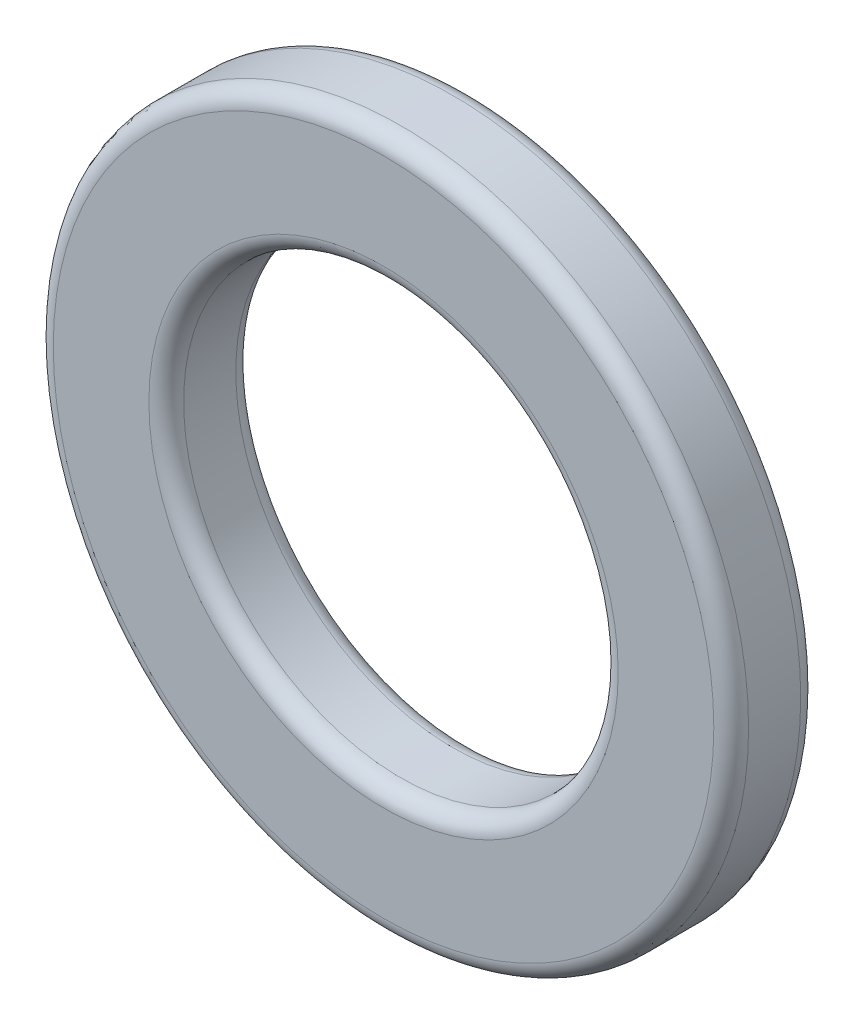
ISO-10303-21;
HEADER;
FILE_DESCRIPTION(('STEP AP214'),'2;1');
FILE_NAME('part.step','',(''),(''),'','','');
FILE_SCHEMA(('AUTOMOTIVE_DESIGN { 1 0 10303 214 1 1 1 1 }'));
ENDSEC;
DATA;
#1=APPLICATION_CONTEXT('core data for automotive mechanical design processes');
#2=APPLICATION_PROTOCOL_DEFINITION('international standard','automotive_design',2000,#1);
#3=PRODUCT_CONTEXT('',#1,'mechanical');
#4=PRODUCT('Part','Part','',(#3));
#5=PRODUCT_RELATED_PRODUCT_CATEGORY('part','',(#4));
#6=PRODUCT_DEFINITION_FORMATION('','',#4);
#7=PRODUCT_DEFINITION_CONTEXT('part definition',#1,'design');
#8=PRODUCT_DEFINITION('design','',#6,#7);
#9=PRODUCT_DEFINITION_SHAPE('','',#8);
#10=(LENGTH_UNIT() NAMED_UNIT(*) SI_UNIT(.MILLI.,.METRE.));
#11=(NAMED_UNIT(*) PLANE_ANGLE_UNIT() SI_UNIT($,.RADIAN.));
#12=(NAMED_UNIT(*) SI_UNIT($,.STERADIAN.) SOLID_ANGLE_UNIT());
#13=UNCERTAINTY_MEASURE_WITH_UNIT(LENGTH_MEASURE(1.E-05),#10,'distance_accuracy_value','');
#14=(GEOMETRIC_REPRESENTATION_CONTEXT(3) GLOBAL_UNCERTAINTY_ASSIGNED_CONTEXT((#13)) GLOBAL_UNIT_ASSIGNED_CONTEXT((#10,
#11,#12)) REPRESENTATION_CONTEXT('',''));
#15=CARTESIAN_POINT('',(0.,0.,0.));
#16=DIRECTION('',(0.,0.,1.));
#17=DIRECTION('',(1.,0.,0.));
#18=AXIS2_PLACEMENT_3D('',#15,#16,#17);
#19=CARTESIAN_POINT('',(0.,0.,2.54));
#20=DIRECTION('',(0.,0.,1.));
#21=DIRECTION('',(1.,0.,0.));
#22=AXIS2_PLACEMENT_3D('',#19,#20,#21);
#23=PLANE('',#22);
#24=CARTESIAN_POINT('',(0.,0.,2.54));
#25=DIRECTION('',(0.,0.,1.));
#26=DIRECTION('',(1.,0.,0.));
#27=AXIS2_PLACEMENT_3D('',#24,#25,#26);
#28=CIRCLE('',#27,6.858);
#29=CARTESIAN_POINT('',(6.858,0.,2.54));
#30=VERTEX_POINT('',#29);
#31=EDGE_CURVE('E62',#30,#30,#28,.F.);
#32=ORIENTED_EDGE('',*,*,#31,.T.);
#33=EDGE_LOOP('',(#32));
#34=FACE_BOUND('',#33,.T.);
#35=CARTESIAN_POINT('',(0.,0.,2.54));
#36=DIRECTION('',(0.,0.,1.));
#37=DIRECTION('',(1.,0.,0.));
#38=AXIS2_PLACEMENT_3D('',#35,#36,#37);
#39=CIRCLE('',#38,9.652);
#40=CARTESIAN_POINT('',(9.652,0.,2.54));
#41=VERTEX_POINT('',#40);
#42=EDGE_CURVE('E66',#41,#41,#39,.T.);
#43=ORIENTED_EDGE('',*,*,#42,.T.);
#44=EDGE_LOOP('',(#43));
#45=FACE_BOUND('',#44,.T.);
#46=ADVANCED_FACE('F38',(#34,#45),#23,.T.);
#47=CARTESIAN_POINT('',(0.,0.,0.));
#48=DIRECTION('',(0.,0.,1.));
#49=DIRECTION('',(1.,0.,0.));
#50=AXIS2_PLACEMENT_3D('',#47,#48,#49);
#51=PLANE('',#50);
#52=CARTESIAN_POINT('',(0.,0.,0.));
#53=DIRECTION('',(0.,0.,1.));
#54=DIRECTION('',(1.,0.,0.));
#55=AXIS2_PLACEMENT_3D('',#52,#53,#54);
#56=CIRCLE('',#55,9.652);
#57=CARTESIAN_POINT('',(9.652,0.,0.));
#58=VERTEX_POINT('',#57);
#59=EDGE_CURVE('E10',#58,#58,#56,.F.);
#60=ORIENTED_EDGE('',*,*,#59,.T.);
#61=EDGE_LOOP('',(#60));
#62=FACE_BOUND('',#61,.T.);
#63=CARTESIAN_POINT('',(0.,0.,0.));
#64=DIRECTION('',(0.,0.,1.));
#65=DIRECTION('',(1.,0.,0.));
#66=AXIS2_PLACEMENT_3D('',#63,#64,#65);
#67=CIRCLE('',#66,6.858);
#68=CARTESIAN_POINT('',(6.858,0.,0.));
#69=VERTEX_POINT('',#68);
#70=EDGE_CURVE('E46',#69,#69,#67,.T.);
#71=ORIENTED_EDGE('',*,*,#70,.T.);
#72=EDGE_LOOP('',(#71));
#73=FACE_BOUND('',#72,.T.);
#74=ADVANCED_FACE('F90',(#62,#73),#51,.F.);
#75=CARTESIAN_POINT('',(0.,0.,2.54));
#76=DIRECTION('',(0.,0.,-1.));
#77=DIRECTION('',(-1.,0.,0.));
#78=AXIS2_PLACEMENT_3D('',#75,#76,#77);
#79=CYLINDRICAL_SURFACE('',#78,10.16);
#80=CARTESIAN_POINT('',(0.,0.,2.032));
#81=DIRECTION('',(0.,0.,1.));
#82=DIRECTION('',(1.,0.,0.));
#83=AXIS2_PLACEMENT_3D('',#80,#81,#82);
#84=CIRCLE('',#83,10.16);
#85=CARTESIAN_POINT('',(10.16,0.,2.032));
#86=VERTEX_POINT('',#85);
#87=EDGE_CURVE('E51',#86,#86,#84,.F.);
#88=ORIENTED_EDGE('',*,*,#87,.T.);
#89=EDGE_LOOP('',(#88));
#90=FACE_BOUND('',#89,.T.);
#91=CARTESIAN_POINT('',(0.,0.,0.508));
#92=DIRECTION('',(0.,0.,1.));
#93=DIRECTION('',(1.,0.,0.));
#94=AXIS2_PLACEMENT_3D('',#91,#92,#93);
#95=CIRCLE('',#94,10.16);
#96=CARTESIAN_POINT('',(10.16,0.,0.508));
#97=VERTEX_POINT('',#96);
#98=EDGE_CURVE('E56',#97,#97,#95,.T.);
#99=ORIENTED_EDGE('',*,*,#98,.T.);
#100=EDGE_LOOP('',(#99));
#101=FACE_BOUND('',#100,.T.);
#102=ADVANCED_FACE('F96',(#90,#101),#79,.T.);
#103=CARTESIAN_POINT('',(0.,0.,2.54));
#104=DIRECTION('',(0.,0.,-1.));
#105=DIRECTION('',(-1.,0.,0.));
#106=AXIS2_PLACEMENT_3D('',#103,#104,#105);
#107=CYLINDRICAL_SURFACE('',#106,6.35);
#108=CARTESIAN_POINT('',(0.,0.,2.032));
#109=DIRECTION('',(0.,0.,1.));
#110=DIRECTION('',(1.,0.,0.));
#111=AXIS2_PLACEMENT_3D('',#108,#109,#110);
#112=CIRCLE('',#111,6.35);
#113=CARTESIAN_POINT('',(6.35,0.,2.032));
#114=VERTEX_POINT('',#113);
#115=EDGE_CURVE('E70',#114,#114,#112,.T.);
#116=ORIENTED_EDGE('',*,*,#115,.T.);
#117=EDGE_LOOP('',(#116));
#118=FACE_BOUND('',#117,.T.);
#119=CARTESIAN_POINT('',(0.,0.,0.508));
#120=DIRECTION('',(0.,0.,1.));
#121=DIRECTION('',(1.,0.,0.));
#122=AXIS2_PLACEMENT_3D('',#119,#120,#121);
#123=CIRCLE('',#122,6.35);
#124=CARTESIAN_POINT('',(6.35,0.,0.508));
#125=VERTEX_POINT('',#124);
#126=EDGE_CURVE('E74',#125,#125,#123,.F.);
#127=ORIENTED_EDGE('',*,*,#126,.T.);
#128=EDGE_LOOP('',(#127));
#129=FACE_BOUND('',#128,.T.);
#130=ADVANCED_FACE('F79',(#118,#129),#107,.F.);
#131=CARTESIAN_POINT('',(0.,0.,2.032));
#132=DIRECTION('',(0.,0.,1.));
#133=DIRECTION('',(1.,0.,0.));
#134=AXIS2_PLACEMENT_3D('',#131,#132,#133);
#135=TOROIDAL_SURFACE('',#134,6.858,0.508);
#136=ORIENTED_EDGE('',*,*,#31,.F.);
#137=EDGE_LOOP('',(#136));
#138=FACE_BOUND('',#137,.T.);
#139=ORIENTED_EDGE('',*,*,#115,.F.);
#140=EDGE_LOOP('',(#139));
#141=FACE_BOUND('',#140,.T.);
#142=ADVANCED_FACE('F104',(#138,#141),#135,.T.);
#143=CARTESIAN_POINT('',(0.,0.,2.032));
#144=DIRECTION('',(0.,0.,1.));
#145=DIRECTION('',(1.,0.,0.));
#146=AXIS2_PLACEMENT_3D('',#143,#144,#145);
#147=TOROIDAL_SURFACE('',#146,9.652,0.508);
#148=ORIENTED_EDGE('',*,*,#87,.F.);
#149=EDGE_LOOP('',(#148));
#150=FACE_BOUND('',#149,.T.);
#151=ORIENTED_EDGE('',*,*,#42,.F.);
#152=EDGE_LOOP('',(#151));
#153=FACE_BOUND('',#152,.T.);
#154=ADVANCED_FACE('F87',(#150,#153),#147,.T.);
#155=CARTESIAN_POINT('',(0.,0.,0.508));
#156=DIRECTION('',(0.,0.,1.));
#157=DIRECTION('',(1.,0.,0.));
#158=AXIS2_PLACEMENT_3D('',#155,#156,#157);
#159=TOROIDAL_SURFACE('',#158,9.652,0.508);
#160=ORIENTED_EDGE('',*,*,#59,.F.);
#161=EDGE_LOOP('',(#160));
#162=FACE_BOUND('',#161,.T.);
#163=ORIENTED_EDGE('',*,*,#98,.F.);
#164=EDGE_LOOP('',(#163));
#165=FACE_BOUND('',#164,.T.);
#166=ADVANCED_FACE('F83',(#162,#165),#159,.T.);
#167=CARTESIAN_POINT('',(0.,0.,0.508));
#168=DIRECTION('',(0.,0.,1.));
#169=DIRECTION('',(1.,0.,0.));
#170=AXIS2_PLACEMENT_3D('',#167,#168,#169);
#171=TOROIDAL_SURFACE('',#170,6.858,0.508);
#172=ORIENTED_EDGE('',*,*,#126,.F.);
#173=EDGE_LOOP('',(#172));
#174=FACE_BOUND('',#173,.T.);
#175=ORIENTED_EDGE('',*,*,#70,.F.);
#176=EDGE_LOOP('',(#175));
#177=FACE_BOUND('',#176,.T.);
#178=ADVANCED_FACE('F40',(#174,#177),#171,.T.);
#179=CLOSED_SHELL('',(#46,#74,#102,#130,#142,#154,#166,#178));
#180=MANIFOLD_SOLID_BREP('B2',#179);
#181=ADVANCED_BREP_SHAPE_REPRESENTATION('',(#18,#180),#14);
#182=SHAPE_DEFINITION_REPRESENTATION(#9,#181);
ENDSEC;
END-ISO-10303-21;
